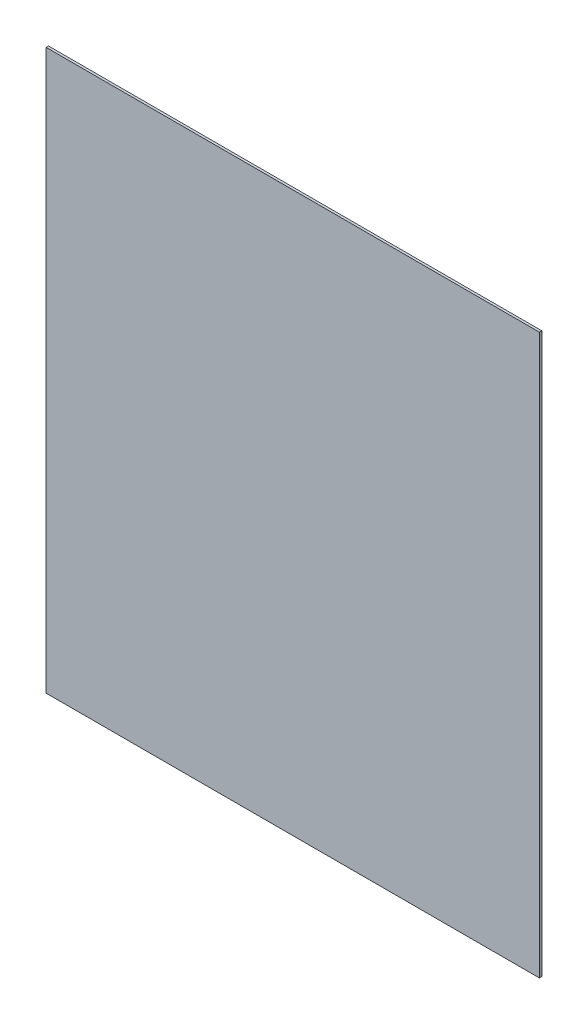
ISO-10303-21;
HEADER;
FILE_DESCRIPTION(('STEP AP214'),'2;1');
FILE_NAME('part.step','',(''),(''),'','','');
FILE_SCHEMA(('AUTOMOTIVE_DESIGN { 1 0 10303 214 1 1 1 1 }'));
ENDSEC;
DATA;
#1=APPLICATION_CONTEXT('core data for automotive mechanical design processes');
#2=APPLICATION_PROTOCOL_DEFINITION('international standard','automotive_design',2000,#1);
#3=PRODUCT_CONTEXT('',#1,'mechanical');
#4=PRODUCT('Part','Part','',(#3));
#5=PRODUCT_RELATED_PRODUCT_CATEGORY('part','',(#4));
#6=PRODUCT_DEFINITION_FORMATION('','',#4);
#7=PRODUCT_DEFINITION_CONTEXT('part definition',#1,'design');
#8=PRODUCT_DEFINITION('design','',#6,#7);
#9=PRODUCT_DEFINITION_SHAPE('','',#8);
#10=(LENGTH_UNIT() NAMED_UNIT(*) SI_UNIT(.MILLI.,.METRE.));
#11=(NAMED_UNIT(*) PLANE_ANGLE_UNIT() SI_UNIT($,.RADIAN.));
#12=(NAMED_UNIT(*) SI_UNIT($,.STERADIAN.) SOLID_ANGLE_UNIT());
#13=UNCERTAINTY_MEASURE_WITH_UNIT(LENGTH_MEASURE(1.E-05),#10,'distance_accuracy_value','');
#14=(GEOMETRIC_REPRESENTATION_CONTEXT(3) GLOBAL_UNCERTAINTY_ASSIGNED_CONTEXT((#13)) GLOBAL_UNIT_ASSIGNED_CONTEXT((#10,
#11,#12)) REPRESENTATION_CONTEXT('',''));
#15=CARTESIAN_POINT('',(0.,0.,0.));
#16=DIRECTION('',(0.,0.,1.));
#17=DIRECTION('',(1.,0.,0.));
#18=AXIS2_PLACEMENT_3D('',#15,#16,#17);
#19=CARTESIAN_POINT('',(-256.013393359467,233.,62.5));
#20=DIRECTION('',(0.,1.,0.));
#21=DIRECTION('',(0.,0.,1.));
#22=AXIS2_PLACEMENT_3D('',#19,#20,#21);
#23=PLANE('',#22);
#24=DIRECTION('',(1.,0.,0.));
#25=VECTOR('',#24,1.);
#26=CARTESIAN_POINT('',(-207.5,233.,62.5));
#27=LINE('',#26,#25);
#28=CARTESIAN_POINT('',(-205.5,233.,62.5));
#29=VERTEX_POINT('',#28);
#30=CARTESIAN_POINT('',(205.5,233.,62.5));
#31=VERTEX_POINT('',#30);
#32=EDGE_CURVE('E37',#29,#31,#27,.T.);
#33=ORIENTED_EDGE('',*,*,#32,.T.);
#34=DIRECTION('',(0.,0.,-1.));
#35=VECTOR('',#34,1.);
#36=CARTESIAN_POINT('',(205.5,233.,-133.832293437024));
#37=LINE('',#36,#35);
#38=CARTESIAN_POINT('',(205.5,233.,60.5));
#39=VERTEX_POINT('',#38);
#40=EDGE_CURVE('E84',#31,#39,#37,.T.);
#41=ORIENTED_EDGE('',*,*,#40,.T.);
#42=DIRECTION('',(1.,0.,0.));
#43=VECTOR('',#42,1.);
#44=CARTESIAN_POINT('',(0.,233.,60.5));
#45=LINE('',#44,#43);
#46=CARTESIAN_POINT('',(-205.5,233.,60.5));
#47=VERTEX_POINT('',#46);
#48=EDGE_CURVE('E79',#47,#39,#45,.T.);
#49=ORIENTED_EDGE('',*,*,#48,.F.);
#50=DIRECTION('',(0.,0.,1.));
#51=VECTOR('',#50,1.);
#52=CARTESIAN_POINT('',(-205.5,233.,-133.832293437024));
#53=LINE('',#52,#51);
#54=EDGE_CURVE('E81',#47,#29,#53,.T.);
#55=ORIENTED_EDGE('',*,*,#54,.T.);
#56=EDGE_LOOP('',(#33,#41,#49,#55));
#57=FACE_BOUND('',#56,.T.);
#58=ADVANCED_FACE('F34',(#57),#23,.T.);
#59=CARTESIAN_POINT('',(-301.446567486664,-233.,62.5));
#60=DIRECTION('',(0.,-1.,0.));
#61=DIRECTION('',(0.,0.,-1.));
#62=AXIS2_PLACEMENT_3D('',#59,#60,#61);
#63=PLANE('',#62);
#64=DIRECTION('',(-1.,0.,0.));
#65=VECTOR('',#64,1.);
#66=CARTESIAN_POINT('',(-207.5,-233.,62.5));
#67=LINE('',#66,#65);
#68=CARTESIAN_POINT('',(205.5,-233.,62.5));
#69=VERTEX_POINT('',#68);
#70=CARTESIAN_POINT('',(-205.5,-233.,62.5));
#71=VERTEX_POINT('',#70);
#72=EDGE_CURVE('E42',#69,#71,#67,.T.);
#73=ORIENTED_EDGE('',*,*,#72,.T.);
#74=DIRECTION('',(0.,0.,-1.));
#75=VECTOR('',#74,1.);
#76=CARTESIAN_POINT('',(-205.5,-233.,-133.832293437024));
#77=LINE('',#76,#75);
#78=CARTESIAN_POINT('',(-205.5,-233.,60.5));
#79=VERTEX_POINT('',#78);
#80=EDGE_CURVE('E88',#71,#79,#77,.T.);
#81=ORIENTED_EDGE('',*,*,#80,.T.);
#82=DIRECTION('',(1.,0.,0.));
#83=VECTOR('',#82,1.);
#84=CARTESIAN_POINT('',(0.,-233.,60.5));
#85=LINE('',#84,#83);
#86=CARTESIAN_POINT('',(205.5,-233.,60.5));
#87=VERTEX_POINT('',#86);
#88=EDGE_CURVE('E11',#79,#87,#85,.T.);
#89=ORIENTED_EDGE('',*,*,#88,.T.);
#90=DIRECTION('',(0.,0.,1.));
#91=VECTOR('',#90,1.);
#92=CARTESIAN_POINT('',(205.5,-233.,-133.832293437024));
#93=LINE('',#92,#91);
#94=EDGE_CURVE('E89',#87,#69,#93,.T.);
#95=ORIENTED_EDGE('',*,*,#94,.T.);
#96=EDGE_LOOP('',(#73,#81,#89,#95));
#97=FACE_BOUND('',#96,.T.);
#98=ADVANCED_FACE('F108',(#97),#63,.T.);
#99=CARTESIAN_POINT('',(205.5,235.,-133.832293437024));
#100=DIRECTION('',(-1.,0.,0.));
#101=DIRECTION('',(0.,0.,1.));
#102=AXIS2_PLACEMENT_3D('',#99,#100,#101);
#103=PLANE('',#102);
#104=ORIENTED_EDGE('',*,*,#40,.F.);
#105=DIRECTION('',(0.,1.,0.));
#106=VECTOR('',#105,1.);
#107=CARTESIAN_POINT('',(205.5,235.,62.5));
#108=LINE('',#107,#106);
#109=EDGE_CURVE('E94',#69,#31,#108,.T.);
#110=ORIENTED_EDGE('',*,*,#109,.F.);
#111=ORIENTED_EDGE('',*,*,#94,.F.);
#112=DIRECTION('',(0.,-1.,0.));
#113=VECTOR('',#112,1.);
#114=CARTESIAN_POINT('',(205.5,235.,60.5));
#115=LINE('',#114,#113);
#116=EDGE_CURVE('E50',#39,#87,#115,.T.);
#117=ORIENTED_EDGE('',*,*,#116,.F.);
#118=EDGE_LOOP('',(#104,#110,#111,#117));
#119=FACE_BOUND('',#118,.T.);
#120=ADVANCED_FACE('F107',(#119),#103,.F.);
#121=CARTESIAN_POINT('',(-205.5,235.,-133.832293437024));
#122=DIRECTION('',(1.,0.,0.));
#123=DIRECTION('',(0.,0.,-1.));
#124=AXIS2_PLACEMENT_3D('',#121,#122,#123);
#125=PLANE('',#124);
#126=ORIENTED_EDGE('',*,*,#54,.F.);
#127=DIRECTION('',(0.,-1.,0.));
#128=VECTOR('',#127,1.);
#129=CARTESIAN_POINT('',(-205.5,235.,60.5));
#130=LINE('',#129,#128);
#131=EDGE_CURVE('E58',#47,#79,#130,.T.);
#132=ORIENTED_EDGE('',*,*,#131,.T.);
#133=ORIENTED_EDGE('',*,*,#80,.F.);
#134=DIRECTION('',(0.,1.,0.));
#135=VECTOR('',#134,1.);
#136=CARTESIAN_POINT('',(-205.5,235.,62.5));
#137=LINE('',#136,#135);
#138=EDGE_CURVE('E87',#71,#29,#137,.T.);
#139=ORIENTED_EDGE('',*,*,#138,.T.);
#140=EDGE_LOOP('',(#126,#132,#133,#139));
#141=FACE_BOUND('',#140,.T.);
#142=ADVANCED_FACE('F86',(#141),#125,.F.);
#143=CARTESIAN_POINT('',(-207.5,235.,60.5));
#144=DIRECTION('',(0.,0.,-1.));
#145=DIRECTION('',(-1.,0.,0.));
#146=AXIS2_PLACEMENT_3D('',#143,#144,#145);
#147=PLANE('',#146);
#148=ORIENTED_EDGE('',*,*,#88,.F.);
#149=ORIENTED_EDGE('',*,*,#131,.F.);
#150=ORIENTED_EDGE('',*,*,#48,.T.);
#151=ORIENTED_EDGE('',*,*,#116,.T.);
#152=EDGE_LOOP('',(#148,#149,#150,#151));
#153=FACE_BOUND('',#152,.T.);
#154=ADVANCED_FACE('F91',(#153),#147,.T.);
#155=CARTESIAN_POINT('',(-207.5,235.,62.5));
#156=DIRECTION('',(0.,0.,-1.));
#157=DIRECTION('',(-1.,0.,0.));
#158=AXIS2_PLACEMENT_3D('',#155,#156,#157);
#159=PLANE('',#158);
#160=ORIENTED_EDGE('',*,*,#32,.F.);
#161=ORIENTED_EDGE('',*,*,#138,.F.);
#162=ORIENTED_EDGE('',*,*,#72,.F.);
#163=ORIENTED_EDGE('',*,*,#109,.T.);
#164=EDGE_LOOP('',(#160,#161,#162,#163));
#165=FACE_BOUND('',#164,.T.);
#166=ADVANCED_FACE('F104',(#165),#159,.F.);
#167=CLOSED_SHELL('',(#58,#98,#120,#142,#154,#166));
#168=MANIFOLD_SOLID_BREP('B2',#167);
#169=ADVANCED_BREP_SHAPE_REPRESENTATION('',(#18,#168),#14);
#170=SHAPE_DEFINITION_REPRESENTATION(#9,#169);
ENDSEC;
END-ISO-10303-21;
